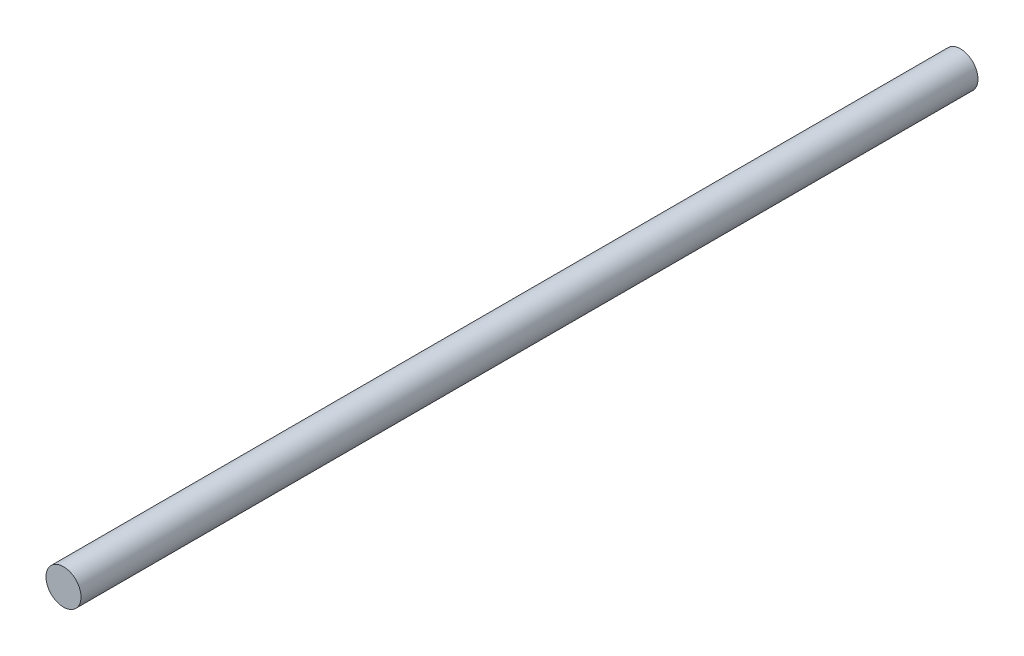
ISO-10303-21;
HEADER;
FILE_DESCRIPTION(('STEP AP214'),'2;1');
FILE_NAME('part.step','',(''),(''),'','','');
FILE_SCHEMA(('AUTOMOTIVE_DESIGN { 1 0 10303 214 1 1 1 1 }'));
ENDSEC;
DATA;
#1=APPLICATION_CONTEXT('core data for automotive mechanical design processes');
#2=APPLICATION_PROTOCOL_DEFINITION('international standard','automotive_design',2000,#1);
#3=PRODUCT_CONTEXT('',#1,'mechanical');
#4=PRODUCT('Part','Part','',(#3));
#5=PRODUCT_RELATED_PRODUCT_CATEGORY('part','',(#4));
#6=PRODUCT_DEFINITION_FORMATION('','',#4);
#7=PRODUCT_DEFINITION_CONTEXT('part definition',#1,'design');
#8=PRODUCT_DEFINITION('design','',#6,#7);
#9=PRODUCT_DEFINITION_SHAPE('','',#8);
#10=(LENGTH_UNIT() NAMED_UNIT(*) SI_UNIT(.MILLI.,.METRE.));
#11=(NAMED_UNIT(*) PLANE_ANGLE_UNIT() SI_UNIT($,.RADIAN.));
#12=(NAMED_UNIT(*) SI_UNIT($,.STERADIAN.) SOLID_ANGLE_UNIT());
#13=UNCERTAINTY_MEASURE_WITH_UNIT(LENGTH_MEASURE(1.E-05),#10,'distance_accuracy_value','');
#14=(GEOMETRIC_REPRESENTATION_CONTEXT(3) GLOBAL_UNCERTAINTY_ASSIGNED_CONTEXT((#13)) GLOBAL_UNIT_ASSIGNED_CONTEXT((#10,
#11,#12)) REPRESENTATION_CONTEXT('',''));
#15=CARTESIAN_POINT('',(0.,0.,0.));
#16=DIRECTION('',(0.,0.,1.));
#17=DIRECTION('',(1.,0.,0.));
#18=AXIS2_PLACEMENT_3D('',#15,#16,#17);
#19=CARTESIAN_POINT('',(0.,0.,650.));
#20=DIRECTION('',(0.,0.,-1.));
#21=DIRECTION('',(-1.,0.,0.));
#22=AXIS2_PLACEMENT_3D('',#19,#20,#21);
#23=CYLINDRICAL_SURFACE('',#22,12.7);
#24=CARTESIAN_POINT('',(0.,0.,650.));
#25=DIRECTION('',(0.,0.,1.));
#26=DIRECTION('',(1.,0.,0.));
#27=AXIS2_PLACEMENT_3D('',#24,#25,#26);
#28=CIRCLE('',#27,12.7);
#29=CARTESIAN_POINT('',(12.7,0.,650.));
#30=VERTEX_POINT('',#29);
#31=EDGE_CURVE('E10',#30,#30,#28,.T.);
#32=ORIENTED_EDGE('',*,*,#31,.F.);
#33=EDGE_LOOP('',(#32));
#34=FACE_BOUND('',#33,.T.);
#35=CARTESIAN_POINT('',(0.,0.,0.));
#36=DIRECTION('',(0.,0.,1.));
#37=DIRECTION('',(1.,0.,0.));
#38=AXIS2_PLACEMENT_3D('',#35,#36,#37);
#39=CIRCLE('',#38,12.7);
#40=CARTESIAN_POINT('',(12.7,0.,0.));
#41=VERTEX_POINT('',#40);
#42=EDGE_CURVE('E34',#41,#41,#39,.T.);
#43=ORIENTED_EDGE('',*,*,#42,.T.);
#44=EDGE_LOOP('',(#43));
#45=FACE_BOUND('',#44,.T.);
#46=ADVANCED_FACE('F31',(#34,#45),#23,.T.);
#47=CARTESIAN_POINT('',(0.,0.,650.));
#48=DIRECTION('',(0.,0.,1.));
#49=DIRECTION('',(1.,0.,0.));
#50=AXIS2_PLACEMENT_3D('',#47,#48,#49);
#51=PLANE('',#50);
#52=ORIENTED_EDGE('',*,*,#31,.T.);
#53=EDGE_LOOP('',(#52));
#54=FACE_BOUND('',#53,.T.);
#55=ADVANCED_FACE('F46',(#54),#51,.T.);
#56=CARTESIAN_POINT('',(0.,0.,0.));
#57=DIRECTION('',(0.,0.,1.));
#58=DIRECTION('',(1.,0.,0.));
#59=AXIS2_PLACEMENT_3D('',#56,#57,#58);
#60=PLANE('',#59);
#61=ORIENTED_EDGE('',*,*,#42,.F.);
#62=EDGE_LOOP('',(#61));
#63=FACE_BOUND('',#62,.T.);
#64=ADVANCED_FACE('F44',(#63),#60,.F.);
#65=CLOSED_SHELL('',(#46,#55,#64));
#66=MANIFOLD_SOLID_BREP('B2',#65);
#67=ADVANCED_BREP_SHAPE_REPRESENTATION('',(#18,#66),#14);
#68=SHAPE_DEFINITION_REPRESENTATION(#9,#67);
ENDSEC;
END-ISO-10303-21;
